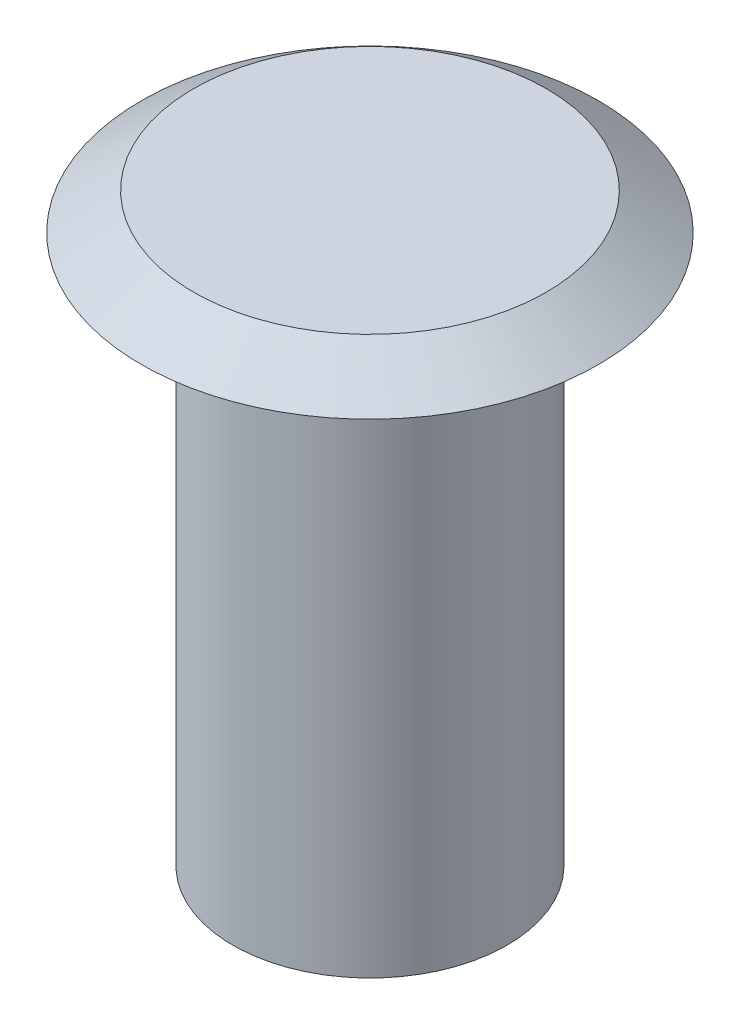
ISO-10303-21;
HEADER;
FILE_DESCRIPTION(('STEP AP214'),'2;1');
FILE_NAME('part.step','',(''),(''),'','','');
FILE_SCHEMA(('AUTOMOTIVE_DESIGN { 1 0 10303 214 1 1 1 1 }'));
ENDSEC;
DATA;
#1=APPLICATION_CONTEXT('core data for automotive mechanical design processes');
#2=APPLICATION_PROTOCOL_DEFINITION('international standard','automotive_design',2000,#1);
#3=PRODUCT_CONTEXT('',#1,'mechanical');
#4=PRODUCT('Part','Part','',(#3));
#5=PRODUCT_RELATED_PRODUCT_CATEGORY('part','',(#4));
#6=PRODUCT_DEFINITION_FORMATION('','',#4);
#7=PRODUCT_DEFINITION_CONTEXT('part definition',#1,'design');
#8=PRODUCT_DEFINITION('design','',#6,#7);
#9=PRODUCT_DEFINITION_SHAPE('','',#8);
#10=(LENGTH_UNIT() NAMED_UNIT(*) SI_UNIT(.MILLI.,.METRE.));
#11=(NAMED_UNIT(*) PLANE_ANGLE_UNIT() SI_UNIT($,.RADIAN.));
#12=(NAMED_UNIT(*) SI_UNIT($,.STERADIAN.) SOLID_ANGLE_UNIT());
#13=UNCERTAINTY_MEASURE_WITH_UNIT(LENGTH_MEASURE(1.E-05),#10,'distance_accuracy_value','');
#14=(GEOMETRIC_REPRESENTATION_CONTEXT(3) GLOBAL_UNCERTAINTY_ASSIGNED_CONTEXT((#13)) GLOBAL_UNIT_ASSIGNED_CONTEXT((#10,
#11,#12)) REPRESENTATION_CONTEXT('',''));
#15=CARTESIAN_POINT('',(0.,0.,0.));
#16=DIRECTION('',(0.,0.,1.));
#17=DIRECTION('',(1.,0.,0.));
#18=AXIS2_PLACEMENT_3D('',#15,#16,#17);
#19=CARTESIAN_POINT('',(0.,6.4,0.));
#20=DIRECTION('',(0.,-1.,0.));
#21=DIRECTION('',(0.,0.,-1.));
#22=AXIS2_PLACEMENT_3D('',#19,#20,#21);
#23=PLANE('',#22);
#24=CARTESIAN_POINT('',(0.,6.4,0.));
#25=DIRECTION('',(0.,-1.,0.));
#26=DIRECTION('',(0.,0.,-1.));
#27=AXIS2_PLACEMENT_3D('',#24,#25,#26);
#28=CIRCLE('',#27,1.92874079730315);
#29=CARTESIAN_POINT('',(0.,6.4,-1.92874079730315));
#30=VERTEX_POINT('',#29);
#31=EDGE_CURVE('E10',#30,#30,#28,.T.);
#32=ORIENTED_EDGE('',*,*,#31,.F.);
#33=EDGE_LOOP('',(#32));
#34=FACE_BOUND('',#33,.T.);
#35=ADVANCED_FACE('F39',(#34),#23,.F.);
#36=CARTESIAN_POINT('',(0.,6.4,0.));
#37=DIRECTION('',(0.,-1.,0.));
#38=DIRECTION('',(0.,0.,-1.));
#39=AXIS2_PLACEMENT_3D('',#36,#37,#38);
#40=CONICAL_SURFACE('',#39,1.92874079730315,0.959931088596886);
#41=CARTESIAN_POINT('',(0.,6.,0.));
#42=DIRECTION('',(0.,-1.,0.));
#43=DIRECTION('',(0.,0.,-1.));
#44=AXIS2_PLACEMENT_3D('',#41,#42,#43);
#45=CIRCLE('',#44,2.5);
#46=CARTESIAN_POINT('',(0.,6.,-2.5));
#47=VERTEX_POINT('',#46);
#48=EDGE_CURVE('E45',#47,#47,#45,.T.);
#49=ORIENTED_EDGE('',*,*,#48,.F.);
#50=EDGE_LOOP('',(#49));
#51=FACE_BOUND('',#50,.T.);
#52=ORIENTED_EDGE('',*,*,#31,.T.);
#53=EDGE_LOOP('',(#52));
#54=FACE_BOUND('',#53,.T.);
#55=ADVANCED_FACE('F87',(#51,#54),#40,.T.);
#56=CARTESIAN_POINT('',(-2.5,6.,0.));
#57=DIRECTION('',(0.,1.,0.));
#58=DIRECTION('',(0.,0.,1.));
#59=AXIS2_PLACEMENT_3D('',#56,#57,#58);
#60=PLANE('',#59);
#61=CARTESIAN_POINT('',(0.,6.,0.));
#62=DIRECTION('',(0.,-1.,0.));
#63=DIRECTION('',(0.,0.,-1.));
#64=AXIS2_PLACEMENT_3D('',#61,#62,#63);
#65=CIRCLE('',#64,1.5);
#66=CARTESIAN_POINT('',(0.,6.,-1.5));
#67=VERTEX_POINT('',#66);
#68=EDGE_CURVE('E49',#67,#67,#65,.T.);
#69=ORIENTED_EDGE('',*,*,#68,.F.);
#70=EDGE_LOOP('',(#69));
#71=FACE_BOUND('',#70,.T.);
#72=ORIENTED_EDGE('',*,*,#48,.T.);
#73=EDGE_LOOP('',(#72));
#74=FACE_BOUND('',#73,.T.);
#75=ADVANCED_FACE('F82',(#71,#74),#60,.F.);
#76=CARTESIAN_POINT('',(0.,0.,0.));
#77=DIRECTION('',(0.,-1.,0.));
#78=DIRECTION('',(0.,0.,-1.));
#79=AXIS2_PLACEMENT_3D('',#76,#77,#78);
#80=CYLINDRICAL_SURFACE('',#79,1.5);
#81=CARTESIAN_POINT('',(0.,0.,0.));
#82=DIRECTION('',(0.,-1.,0.));
#83=DIRECTION('',(0.,0.,-1.));
#84=AXIS2_PLACEMENT_3D('',#81,#82,#83);
#85=CIRCLE('',#84,1.5);
#86=CARTESIAN_POINT('',(0.,0.,-1.5));
#87=VERTEX_POINT('',#86);
#88=EDGE_CURVE('E53',#87,#87,#85,.T.);
#89=ORIENTED_EDGE('',*,*,#88,.F.);
#90=EDGE_LOOP('',(#89));
#91=FACE_BOUND('',#90,.T.);
#92=ORIENTED_EDGE('',*,*,#68,.T.);
#93=EDGE_LOOP('',(#92));
#94=FACE_BOUND('',#93,.T.);
#95=ADVANCED_FACE('F76',(#91,#94),#80,.T.);
#96=CARTESIAN_POINT('',(-1.5,0.,0.));
#97=DIRECTION('',(0.,1.,0.));
#98=DIRECTION('',(0.,0.,1.));
#99=AXIS2_PLACEMENT_3D('',#96,#97,#98);
#100=PLANE('',#99);
#101=CARTESIAN_POINT('',(0.,0.,0.));
#102=DIRECTION('',(0.,-1.,0.));
#103=DIRECTION('',(0.,0.,-1.));
#104=AXIS2_PLACEMENT_3D('',#101,#102,#103);
#105=CIRCLE('',#104,0.6);
#106=CARTESIAN_POINT('',(0.,0.,-0.6));
#107=VERTEX_POINT('',#106);
#108=EDGE_CURVE('E58',#107,#107,#105,.T.);
#109=ORIENTED_EDGE('',*,*,#108,.F.);
#110=EDGE_LOOP('',(#109));
#111=FACE_BOUND('',#110,.T.);
#112=ORIENTED_EDGE('',*,*,#88,.T.);
#113=EDGE_LOOP('',(#112));
#114=FACE_BOUND('',#113,.T.);
#115=ADVANCED_FACE('F70',(#111,#114),#100,.F.);
#116=CARTESIAN_POINT('',(0.,0.,0.));
#117=DIRECTION('',(0.,-1.,0.));
#118=DIRECTION('',(0.,0.,-1.));
#119=AXIS2_PLACEMENT_3D('',#116,#117,#118);
#120=CYLINDRICAL_SURFACE('',#119,0.6);
#121=CARTESIAN_POINT('',(0.,4.,0.));
#122=DIRECTION('',(0.,-1.,0.));
#123=DIRECTION('',(0.,0.,-1.));
#124=AXIS2_PLACEMENT_3D('',#121,#122,#123);
#125=CIRCLE('',#124,0.6);
#126=CARTESIAN_POINT('',(0.,4.,-0.6));
#127=VERTEX_POINT('',#126);
#128=EDGE_CURVE('E61',#127,#127,#125,.T.);
#129=ORIENTED_EDGE('',*,*,#128,.F.);
#130=EDGE_LOOP('',(#129));
#131=FACE_BOUND('',#130,.T.);
#132=ORIENTED_EDGE('',*,*,#108,.T.);
#133=EDGE_LOOP('',(#132));
#134=FACE_BOUND('',#133,.T.);
#135=ADVANCED_FACE('F67',(#131,#134),#120,.F.);
#136=CARTESIAN_POINT('',(-0.6,4.,0.));
#137=DIRECTION('',(0.,1.,0.));
#138=DIRECTION('',(0.,0.,1.));
#139=AXIS2_PLACEMENT_3D('',#136,#137,#138);
#140=PLANE('',#139);
#141=ORIENTED_EDGE('',*,*,#128,.T.);
#142=EDGE_LOOP('',(#141));
#143=FACE_BOUND('',#142,.T.);
#144=ADVANCED_FACE('F65',(#143),#140,.F.);
#145=CLOSED_SHELL('',(#35,#55,#75,#95,#115,#135,#144));
#146=MANIFOLD_SOLID_BREP('B2',#145);
#147=ADVANCED_BREP_SHAPE_REPRESENTATION('',(#18,#146),#14);
#148=SHAPE_DEFINITION_REPRESENTATION(#9,#147);
ENDSEC;
END-ISO-10303-21;
